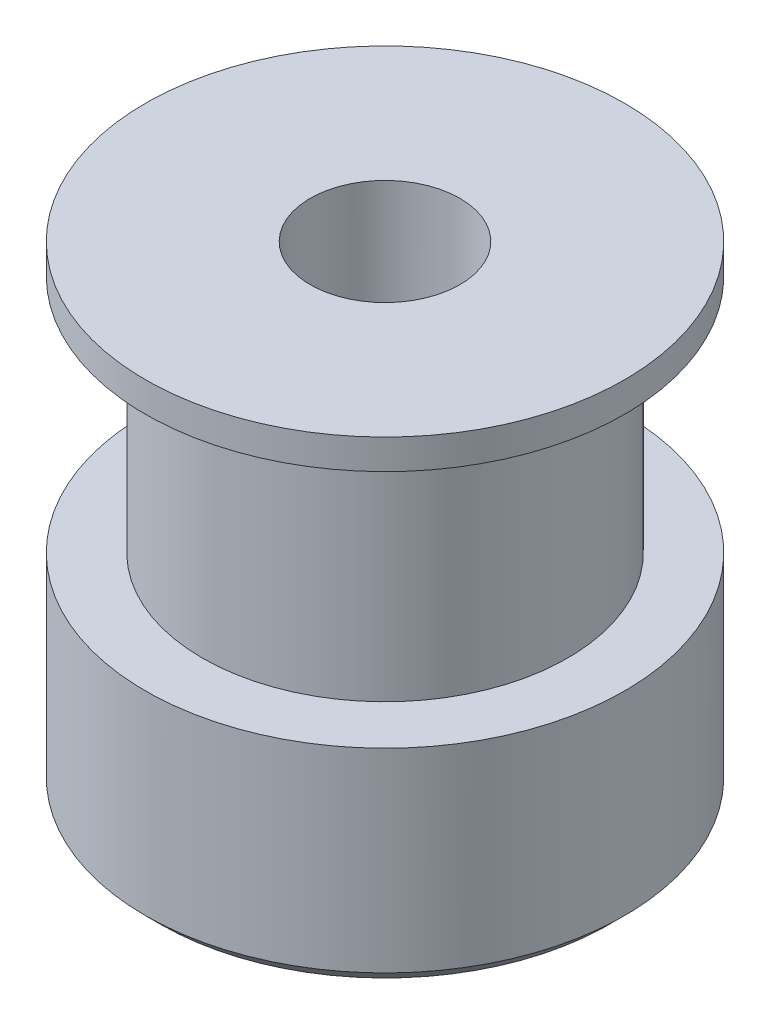
ISO-10303-21;
HEADER;
FILE_DESCRIPTION(('STEP AP214'),'2;1');
FILE_NAME('part.step','',(''),(''),'','','');
FILE_SCHEMA(('AUTOMOTIVE_DESIGN { 1 0 10303 214 1 1 1 1 }'));
ENDSEC;
DATA;
#1=APPLICATION_CONTEXT('core data for automotive mechanical design processes');
#2=APPLICATION_PROTOCOL_DEFINITION('international standard','automotive_design',2000,#1);
#3=PRODUCT_CONTEXT('',#1,'mechanical');
#4=PRODUCT('Part','Part','',(#3));
#5=PRODUCT_RELATED_PRODUCT_CATEGORY('part','',(#4));
#6=PRODUCT_DEFINITION_FORMATION('','',#4);
#7=PRODUCT_DEFINITION_CONTEXT('part definition',#1,'design');
#8=PRODUCT_DEFINITION('design','',#6,#7);
#9=PRODUCT_DEFINITION_SHAPE('','',#8);
#10=(LENGTH_UNIT() NAMED_UNIT(*) SI_UNIT(.MILLI.,.METRE.));
#11=(NAMED_UNIT(*) PLANE_ANGLE_UNIT() SI_UNIT($,.RADIAN.));
#12=(NAMED_UNIT(*) SI_UNIT($,.STERADIAN.) SOLID_ANGLE_UNIT());
#13=UNCERTAINTY_MEASURE_WITH_UNIT(LENGTH_MEASURE(1.E-05),#10,'distance_accuracy_value','');
#14=(GEOMETRIC_REPRESENTATION_CONTEXT(3) GLOBAL_UNCERTAINTY_ASSIGNED_CONTEXT((#13)) GLOBAL_UNIT_ASSIGNED_CONTEXT((#10,
#11,#12)) REPRESENTATION_CONTEXT('',''));
#15=CARTESIAN_POINT('',(0.,0.,0.));
#16=DIRECTION('',(0.,0.,1.));
#17=DIRECTION('',(1.,0.,0.));
#18=AXIS2_PLACEMENT_3D('',#15,#16,#17);
#19=CARTESIAN_POINT('',(-8.,0.,0.));
#20=DIRECTION('',(0.,1.,0.));
#21=DIRECTION('',(0.,0.,1.));
#22=AXIS2_PLACEMENT_3D('',#19,#20,#21);
#23=PLANE('',#22);
#24=CARTESIAN_POINT('',(0.,0.,0.));
#25=DIRECTION('',(0.,1.,0.));
#26=DIRECTION('',(0.,0.,1.));
#27=AXIS2_PLACEMENT_3D('',#24,#25,#26);
#28=CIRCLE('',#27,7.50000000000001);
#29=CARTESIAN_POINT('',(0.,0.,7.50000000000001));
#30=VERTEX_POINT('',#29);
#31=EDGE_CURVE('E39',#30,#30,#28,.F.);
#32=ORIENTED_EDGE('',*,*,#31,.T.);
#33=EDGE_LOOP('',(#32));
#34=FACE_BOUND('',#33,.T.);
#35=CARTESIAN_POINT('',(0.,0.,0.));
#36=DIRECTION('',(0.,-1.,0.));
#37=DIRECTION('',(0.,0.,-1.));
#38=AXIS2_PLACEMENT_3D('',#35,#36,#37);
#39=CIRCLE('',#38,2.5);
#40=CARTESIAN_POINT('',(0.,0.,-2.5));
#41=VERTEX_POINT('',#40);
#42=EDGE_CURVE('E43',#41,#41,#39,.T.);
#43=ORIENTED_EDGE('',*,*,#42,.F.);
#44=EDGE_LOOP('',(#43));
#45=FACE_BOUND('',#44,.T.);
#46=ADVANCED_FACE('F32',(#34,#45),#23,.F.);
#47=CARTESIAN_POINT('',(0.,0.,0.));
#48=DIRECTION('',(0.,-1.,0.));
#49=DIRECTION('',(0.,0.,-1.));
#50=AXIS2_PLACEMENT_3D('',#47,#48,#49);
#51=CYLINDRICAL_SURFACE('',#50,2.5);
#52=CARTESIAN_POINT('',(-2.,3.5,-1.5));
#53=CARTESIAN_POINT('',(-1.99999416642511,3.57547897528964,-1.50000404108592));
#54=CARTESIAN_POINT('',(-2.00433633903481,3.65093843407979,-1.49426852824013));
#55=CARTESIAN_POINT('',(-2.02092590613883,3.79932390396221,-1.47174965152787));
#56=CARTESIAN_POINT('',(-2.03318155043097,3.8722471873851,-1.45495475788936));
#57=CARTESIAN_POINT('',(-2.0636233903473,4.01308364167728,-1.41143486335795));
#58=CARTESIAN_POINT('',(-2.0817666618312,4.08102883803527,-1.3847815450315));
#59=CARTESIAN_POINT('',(-2.12185904995836,4.21143745336792,-1.32252909283019));
#60=CARTESIAN_POINT('',(-2.14380930122416,4.27389922969514,-1.28692729054693));
#61=CARTESIAN_POINT('',(-2.19228594587542,4.39994901666408,-1.20271292747644));
#62=CARTESIAN_POINT('',(-2.21904371037662,4.46274095712394,-1.15304179435289));
#63=CARTESIAN_POINT('',(-2.27226229431061,4.57976476274175,-1.04426801309985));
#64=CARTESIAN_POINT('',(-2.29872287517103,4.6339901516708,-0.985158296729613));
#65=CARTESIAN_POINT('',(-2.35175567858734,4.73813380970969,-0.851442367411702));
#66=CARTESIAN_POINT('',(-2.37803133577818,4.78695446366975,-0.775851995162548));
#67=CARTESIAN_POINT('',(-2.42443786983179,4.87080972244443,-0.615654228271659));
#68=CARTESIAN_POINT('',(-2.44457437988735,4.90585697412271,-0.531055196626331));
#69=CARTESIAN_POINT('',(-2.4747098780044,4.95759592281265,-0.363771406742668));
#70=CARTESIAN_POINT('',(-2.4854930393917,4.9757203609673,-0.281674698130916));
#71=CARTESIAN_POINT('',(-2.49874939277545,4.99794280286312,-0.114970509382709));
#72=CARTESIAN_POINT('',(-2.50123038813308,5.00205397800005,-0.0303654624001544));
#73=CARTESIAN_POINT('',(-2.49783372711539,4.99638625265754,0.127637283737309));
#74=CARTESIAN_POINT('',(-2.49295437513726,4.98826647383069,0.201123832865634));
#75=CARTESIAN_POINT('',(-2.47707997553857,4.96152020435189,0.345464269151767));
#76=CARTESIAN_POINT('',(-2.46608447529309,4.94289293609284,0.416317961051201));
#77=CARTESIAN_POINT('',(-2.43884907201719,4.89583443729622,0.554056780469079));
#78=CARTESIAN_POINT('',(-2.42257910450824,4.867346938861,0.620916491037617));
#79=CARTESIAN_POINT('',(-2.38609637638748,4.80161538377446,0.74898866011561));
#80=CARTESIAN_POINT('',(-2.36588259201812,4.76436905294099,0.81019964620801));
#81=CARTESIAN_POINT('',(-2.32037925976363,4.67716090719555,0.933074267143199));
#82=CARTESIAN_POINT('',(-2.2947718295215,4.62621168826426,0.993918663198193));
#83=CARTESIAN_POINT('',(-2.24255554245601,4.51559588213982,1.10671465909275));
#84=CARTESIAN_POINT('',(-2.21594536703375,4.45591749652549,1.1586540130834));
#85=CARTESIAN_POINT('',(-2.16111075123946,4.32134659383645,1.25824837767417));
#86=CARTESIAN_POINT('',(-2.13305661385124,4.24549242346054,1.30470933188632));
#87=CARTESIAN_POINT('',(-2.08250879557267,4.08529376836339,1.38397217194232));
#88=CARTESIAN_POINT('',(-2.06000490298821,4.00096528387436,1.41679921962189));
#89=CARTESIAN_POINT('',(-2.02895865196731,3.84760636810465,1.46077497064842));
#90=CARTESIAN_POINT('',(-2.01833888618316,3.77995936770336,1.47527903312665));
#91=CARTESIAN_POINT('',(-2.00392150777558,3.64262638970052,1.49480872755284));
#92=CARTESIAN_POINT('',(-2.00011596115116,3.57294287951544,1.49984538302907));
#93=CARTESIAN_POINT('',(-1.99988914321323,3.43344831756429,1.50014781114183));
#94=CARTESIAN_POINT('',(-2.00347810223984,3.36363722278479,1.49540004697659));
#95=CARTESIAN_POINT('',(-2.01751520788652,3.22601265625144,1.47640290574941));
#96=CARTESIAN_POINT('',(-2.02796877613213,3.15820080775975,1.46214601830139));
#97=CARTESIAN_POINT('',(-2.054317683331,3.02628542052021,1.42488312618657));
#98=CARTESIAN_POINT('',(-2.07020622092812,2.96217736346777,1.40188805257362));
#99=CARTESIAN_POINT('',(-2.10571539417587,2.83852228426982,1.34796261057072));
#100=CARTESIAN_POINT('',(-2.12533743689999,2.778976993634,1.31702924888212));
#101=CARTESIAN_POINT('',(-2.17036819177737,2.65475991748775,1.24167439558512));
#102=CARTESIAN_POINT('',(-2.19618239397369,2.59109916490343,1.19582663060303));
#103=CARTESIAN_POINT('',(-2.2482175480362,2.47171451515054,1.09487395518701));
#104=CARTESIAN_POINT('',(-2.27443886711455,2.41599830783088,1.03976018672402));
#105=CARTESIAN_POINT('',(-2.32835625910913,2.30677599264957,0.913274837212768));
#106=CARTESIAN_POINT('',(-2.3558007587587,2.25449927339416,0.840721108780193));
#107=CARTESIAN_POINT('',(-2.40537639133459,2.16309722316335,0.686103100868022));
#108=CARTESIAN_POINT('',(-2.42751104449411,2.12396317215908,0.604045176134704));
#109=CARTESIAN_POINT('',(-2.46252280092775,2.06313179656863,0.438840232972141));
#110=CARTESIAN_POINT('',(-2.47595588067329,2.04037377220889,0.35620596365126));
#111=CARTESIAN_POINT('',(-2.494407389061,2.00928539715374,0.187383063890859));
#112=CARTESIAN_POINT('',(-2.49943534582737,2.00093870928238,0.101198571781971));
#113=CARTESIAN_POINT('',(-2.50040600461976,1.99932539141407,-0.0598120232009817));
#114=CARTESIAN_POINT('',(-2.49747057186327,2.00419666543697,-0.134620583589704));
#115=CARTESIAN_POINT('',(-2.48512948412096,2.02489382438161,-0.282148755978772));
#116=CARTESIAN_POINT('',(-2.47572375706639,2.0407198313216,-0.354868344701912));
#117=CARTESIAN_POINT('',(-2.45149427526962,2.08221957158378,-0.495145481978795));
#118=CARTESIAN_POINT('',(-2.43675966858906,2.10773159612924,-0.562767032608828));
#119=CARTESIAN_POINT('',(-2.40303337447155,2.16764059455475,-0.692781971999982));
#120=CARTESIAN_POINT('',(-2.38404073252268,2.2020395608596,-0.75517418419983));
#121=CARTESIAN_POINT('',(-2.34093432659381,2.28292519656875,-0.880263645295945));
#122=CARTESIAN_POINT('',(-2.31648844639149,2.33031870901686,-0.942258690439938));
#123=CARTESIAN_POINT('',(-2.26601907350661,2.43375303371772,-1.05789751536306));
#124=CARTESIAN_POINT('',(-2.23999385274509,2.4898034256079,-1.11153190956916));
#125=CARTESIAN_POINT('',(-2.18528165666205,2.6172855621777,-1.2159097535057));
#126=CARTESIAN_POINT('',(-2.15667566270901,2.6897664861655,-1.26542406663367));
#127=CARTESIAN_POINT('',(-2.10376464485145,2.84348485276654,-1.35156817210325));
#128=CARTESIAN_POINT('',(-2.07945738811052,2.92471771398141,-1.38820466322661));
#129=CARTESIAN_POINT('',(-2.0408000304796,3.0870642851372,-1.44437116535132));
#130=CARTESIAN_POINT('',(-2.02577665830138,3.16759523596124,-1.46509526060187));
#131=CARTESIAN_POINT('',(-2.00539032320036,3.33209739470368,-1.49289268240426));
#132=CARTESIAN_POINT('',(-2.00000648744643,3.41606076575871,-1.49999550595837));
#133=CARTESIAN_POINT('',(-2.,3.5,-1.5));
#134=B_SPLINE_CURVE_WITH_KNOTS('',3,(#52,#53,#54,#55,#56,#57,#58,#59,#60,#61,#62,#63,#64,#65,
#66,#67,#68,#69,#70,#71,#72,#73,#74,#75,#76,#77,#78,#79,#80,#81,#82,#83,#84,#85,#86,#87,#88,#89,
#90,#91,#92,#93,#94,#95,#96,#97,#98,#99,#100,#101,#102,#103,#104,#105,#106,#107,#108,#109,#110,
#111,#112,#113,#114,#115,#116,#117,#118,#119,#120,#121,#122,#123,#124,#125,#126,#127,#128,#129,
#130,#131,#132,#133),.UNSPECIFIED.,.T.,.F.,(4,2,2,2,2,2,2,2,2,2,2,2,2,2,2,2,2,2,2,2,2,2,2,2,2,2,
2,2,2,2,2,2,2,2,2,2,2,2,2,2,4),(0.,0.226085249493393,0.45240657433077,0.677113624991876,
0.901887762215933,1.15414462390001,1.40659128601844,1.68630157736223,1.9657544327122,
2.21853330858497,2.47107452602766,2.69230130543181,2.91354445887944,3.13607155036377,
3.35865648368878,3.60782810055849,3.85733966656908,4.13576671140276,4.41367760154768,
4.62276298054684,4.83160475643976,5.04073566011181,5.25003193304128,5.45906724365495,
5.6681814915466,5.91499438482002,6.16204457978454,6.44121828011588,6.72020638384847,
6.97891479383337,7.23732973022726,7.46129321849399,7.68525920139648,7.90563970188756,
8.12606965394584,8.37042963549487,8.61506198741954,8.89071695766603,9.16622832484805,
9.41820120134353,9.66962780912277),.UNSPECIFIED.);
#135=CARTESIAN_POINT('',(-2.,3.5,-1.5));
#136=VERTEX_POINT('',#135);
#137=EDGE_CURVE('E97',#136,#136,#134,.T.);
#138=ORIENTED_EDGE('',*,*,#137,.F.);
#139=EDGE_LOOP('',(#138));
#140=FACE_BOUND('',#139,.T.);
#141=CARTESIAN_POINT('',(1.5,3.5,-2.));
#142=CARTESIAN_POINT('',(1.50000404108592,3.57547897528964,-1.99999416642511));
#143=CARTESIAN_POINT('',(1.49426852824014,3.6509384340798,-2.00433633903481));
#144=CARTESIAN_POINT('',(1.47174965152787,3.79932390396222,-2.02092590613883));
#145=CARTESIAN_POINT('',(1.45495475788936,3.8722471873851,-2.03318155043097));
#146=CARTESIAN_POINT('',(1.41143486335795,4.01308364167728,-2.0636233903473));
#147=CARTESIAN_POINT('',(1.3847815450315,4.08102883803527,-2.08176666183119));
#148=CARTESIAN_POINT('',(1.32252909283019,4.21143745336792,-2.12185904995836));
#149=CARTESIAN_POINT('',(1.28692729054693,4.27389922969514,-2.14380930122416));
#150=CARTESIAN_POINT('',(1.20271292747644,4.39994901666408,-2.19228594587542));
#151=CARTESIAN_POINT('',(1.15304179435289,4.46274095712394,-2.21904371037662));
#152=CARTESIAN_POINT('',(1.04426801309985,4.57976476274175,-2.27226229431061));
#153=CARTESIAN_POINT('',(0.985158296729613,4.6339901516708,-2.29872287517103));
#154=CARTESIAN_POINT('',(0.851442367411702,4.7381338097097,-2.35175567858734));
#155=CARTESIAN_POINT('',(0.775851995162548,4.78695446366975,-2.37803133577818));
#156=CARTESIAN_POINT('',(0.615654228271659,4.87080972244443,-2.42443786983179));
#157=CARTESIAN_POINT('',(0.531055196626331,4.90585697412271,-2.44457437988735));
#158=CARTESIAN_POINT('',(0.363771406742667,4.95759592281265,-2.4747098780044));
#159=CARTESIAN_POINT('',(0.281674698130916,4.9757203609673,-2.4854930393917));
#160=CARTESIAN_POINT('',(0.114970509382708,4.99794280286312,-2.49874939277545));
#161=CARTESIAN_POINT('',(0.0303654624001538,5.00205397800006,-2.50123038813308));
#162=CARTESIAN_POINT('',(-0.127637283737309,4.99638625265754,-2.49783372711539));
#163=CARTESIAN_POINT('',(-0.201123832865634,4.98826647383069,-2.49295437513726));
#164=CARTESIAN_POINT('',(-0.345464269151768,4.96152020435189,-2.47707997553857));
#165=CARTESIAN_POINT('',(-0.416317961051201,4.94289293609285,-2.46608447529309));
#166=CARTESIAN_POINT('',(-0.554056780469079,4.89583443729622,-2.43884907201719));
#167=CARTESIAN_POINT('',(-0.620916491037617,4.867346938861,-2.42257910450824));
#168=CARTESIAN_POINT('',(-0.748988660115611,4.80161538377446,-2.38609637638748));
#169=CARTESIAN_POINT('',(-0.810199646208011,4.76436905294099,-2.36588259201812));
#170=CARTESIAN_POINT('',(-0.933074267143199,4.67716090719555,-2.32037925976363));
#171=CARTESIAN_POINT('',(-0.993918663198193,4.62621168826426,-2.2947718295215));
#172=CARTESIAN_POINT('',(-1.10671465909275,4.51559588213982,-2.24255554245601));
#173=CARTESIAN_POINT('',(-1.1586540130834,4.45591749652549,-2.21594536703375));
#174=CARTESIAN_POINT('',(-1.25824837767417,4.32134659383645,-2.16111075123946));
#175=CARTESIAN_POINT('',(-1.30470933188632,4.24549242346054,-2.13305661385124));
#176=CARTESIAN_POINT('',(-1.38397217194232,4.08529376836339,-2.08250879557267));
#177=CARTESIAN_POINT('',(-1.41679921962189,4.00096528387436,-2.06000490298821));
#178=CARTESIAN_POINT('',(-1.46077497064842,3.84760636810465,-2.02895865196731));
#179=CARTESIAN_POINT('',(-1.47527903312665,3.77995936770336,-2.01833888618316));
#180=CARTESIAN_POINT('',(-1.49480872755284,3.64262638970052,-2.00392150777558));
#181=CARTESIAN_POINT('',(-1.49984538302907,3.57294287951544,-2.00011596115116));
#182=CARTESIAN_POINT('',(-1.50014781114183,3.43344831756429,-1.99988914321323));
#183=CARTESIAN_POINT('',(-1.49540004697659,3.36363722278479,-2.00347810223984));
#184=CARTESIAN_POINT('',(-1.47640290574941,3.22601265625144,-2.01751520788652));
#185=CARTESIAN_POINT('',(-1.46214601830139,3.15820080775975,-2.02796877613213));
#186=CARTESIAN_POINT('',(-1.42488312618657,3.02628542052021,-2.054317683331));
#187=CARTESIAN_POINT('',(-1.40188805257362,2.96217736346777,-2.07020622092812));
#188=CARTESIAN_POINT('',(-1.34796261057072,2.83852228426982,-2.10571539417587));
#189=CARTESIAN_POINT('',(-1.31702924888212,2.778976993634,-2.12533743689999));
#190=CARTESIAN_POINT('',(-1.24167439558512,2.65475991748775,-2.17036819177737));
#191=CARTESIAN_POINT('',(-1.19582663060303,2.59109916490343,-2.19618239397369));
#192=CARTESIAN_POINT('',(-1.09487395518701,2.47171451515054,-2.24821754803621));
#193=CARTESIAN_POINT('',(-1.03976018672402,2.41599830783088,-2.27443886711455));
#194=CARTESIAN_POINT('',(-0.913274837212766,2.30677599264957,-2.32835625910913));
#195=CARTESIAN_POINT('',(-0.84072110878019,2.25449927339416,-2.3558007587587));
#196=CARTESIAN_POINT('',(-0.686103100868019,2.16309722316335,-2.40537639133459));
#197=CARTESIAN_POINT('',(-0.604045176134701,2.12396317215908,-2.42751104449411));
#198=CARTESIAN_POINT('',(-0.438840232972137,2.06313179656863,-2.46252280092775));
#199=CARTESIAN_POINT('',(-0.356205963651257,2.04037377220889,-2.47595588067329));
#200=CARTESIAN_POINT('',(-0.187383063890856,2.00928539715374,-2.494407389061));
#201=CARTESIAN_POINT('',(-0.101198571781968,2.00093870928238,-2.49943534582737));
#202=CARTESIAN_POINT('',(0.0598120232009852,1.99932539141407,-2.50040600461976));
#203=CARTESIAN_POINT('',(0.134620583589707,2.00419666543697,-2.49747057186327));
#204=CARTESIAN_POINT('',(0.282148755978775,2.02489382438162,-2.48512948412096));
#205=CARTESIAN_POINT('',(0.354868344701915,2.0407198313216,-2.47572375706639));
#206=CARTESIAN_POINT('',(0.495145481978798,2.08221957158379,-2.45149427526962));
#207=CARTESIAN_POINT('',(0.562767032608831,2.10773159612925,-2.43675966858906));
#208=CARTESIAN_POINT('',(0.692781971999985,2.16764059455475,-2.40303337447155));
#209=CARTESIAN_POINT('',(0.755174184199833,2.2020395608596,-2.38404073252268));
#210=CARTESIAN_POINT('',(0.880263645295948,2.28292519656876,-2.34093432659381));
#211=CARTESIAN_POINT('',(0.942258690439941,2.33031870901687,-2.31648844639149));
#212=CARTESIAN_POINT('',(1.05789751536307,2.43375303371772,-2.26601907350661));
#213=CARTESIAN_POINT('',(1.11153190956916,2.48980342560791,-2.23999385274509));
#214=CARTESIAN_POINT('',(1.2159097535057,2.6172855621777,-2.18528165666204));
#215=CARTESIAN_POINT('',(1.26542406663368,2.6897664861655,-2.15667566270901));
#216=CARTESIAN_POINT('',(1.35156817210325,2.84348485276654,-2.10376464485145));
#217=CARTESIAN_POINT('',(1.38820466322661,2.92471771398142,-2.07945738811052));
#218=CARTESIAN_POINT('',(1.44437116535132,3.0870642851372,-2.0408000304796));
#219=CARTESIAN_POINT('',(1.46509526060187,3.16759523596125,-2.02577665830138));
#220=CARTESIAN_POINT('',(1.49289268240426,3.33209739470368,-2.00539032320036));
#221=CARTESIAN_POINT('',(1.49999550595837,3.41606076575871,-2.00000648744643));
#222=CARTESIAN_POINT('',(1.5,3.5,-2.));
#223=B_SPLINE_CURVE_WITH_KNOTS('',3,(#141,#142,#143,#144,#145,#146,#147,#148,#149,#150,#151,
#152,#153,#154,#155,#156,#157,#158,#159,#160,#161,#162,#163,#164,#165,#166,#167,#168,#169,#170,
#171,#172,#173,#174,#175,#176,#177,#178,#179,#180,#181,#182,#183,#184,#185,#186,#187,#188,#189,
#190,#191,#192,#193,#194,#195,#196,#197,#198,#199,#200,#201,#202,#203,#204,#205,#206,#207,#208,
#209,#210,#211,#212,#213,#214,#215,#216,#217,#218,#219,#220,#221,#222),.UNSPECIFIED.,.T.,.F.,(4,
2,2,2,2,2,2,2,2,2,2,2,2,2,2,2,2,2,2,2,2,2,2,2,2,2,2,2,2,2,2,2,2,2,2,2,2,2,2,2,4),(0.,
0.226085249493392,0.45240657433077,0.677113624991875,0.901887762215933,1.15414462390001,
1.40659128601844,1.68630157736223,1.9657544327122,2.21853330858497,2.47107452602766,
2.69230130543182,2.91354445887944,3.13607155036377,3.35865648368878,3.60782810055849,
3.85733966656908,4.13576671140276,4.41367760154768,4.62276298054684,4.83160475643976,
5.04073566011181,5.25003193304128,5.45906724365495,5.66818149154661,5.91499438482002,
6.16204457978454,6.44121828011588,6.72020638384847,6.97891479383337,7.23732973022726,
7.46129321849399,7.68525920139648,7.90563970188756,8.12606965394584,8.37042963549487,
8.61506198741955,8.89071695766604,9.16622832484805,9.41820120134354,9.66962780912277),.UNSPECIFIED.);
#224=CARTESIAN_POINT('',(1.5,3.5,-2.));
#225=VERTEX_POINT('',#224);
#226=EDGE_CURVE('E67',#225,#225,#223,.T.);
#227=ORIENTED_EDGE('',*,*,#226,.F.);
#228=EDGE_LOOP('',(#227));
#229=FACE_BOUND('',#228,.T.);
#230=CARTESIAN_POINT('',(0.,16.,0.));
#231=DIRECTION('',(0.,-1.,0.));
#232=DIRECTION('',(0.,0.,-1.));
#233=AXIS2_PLACEMENT_3D('',#230,#231,#232);
#234=CIRCLE('',#233,2.5);
#235=CARTESIAN_POINT('',(0.,16.,-2.5));
#236=VERTEX_POINT('',#235);
#237=EDGE_CURVE('E47',#236,#236,#234,.T.);
#238=ORIENTED_EDGE('',*,*,#237,.F.);
#239=EDGE_LOOP('',(#238));
#240=FACE_BOUND('',#239,.T.);
#241=ORIENTED_EDGE('',*,*,#42,.T.);
#242=EDGE_LOOP('',(#241));
#243=FACE_BOUND('',#242,.T.);
#244=ADVANCED_FACE('F141',(#140,#229,#240,#243),#51,.F.);
#245=CARTESIAN_POINT('',(-2.5,16.,0.));
#246=DIRECTION('',(0.,-1.,0.));
#247=DIRECTION('',(0.,0.,-1.));
#248=AXIS2_PLACEMENT_3D('',#245,#246,#247);
#249=PLANE('',#248);
#250=CARTESIAN_POINT('',(0.,16.,0.));
#251=DIRECTION('',(0.,-1.,0.));
#252=DIRECTION('',(0.,0.,-1.));
#253=AXIS2_PLACEMENT_3D('',#250,#251,#252);
#254=CIRCLE('',#253,8.);
#255=CARTESIAN_POINT('',(0.,16.,-8.));
#256=VERTEX_POINT('',#255);
#257=EDGE_CURVE('E52',#256,#256,#254,.T.);
#258=ORIENTED_EDGE('',*,*,#257,.F.);
#259=EDGE_LOOP('',(#258));
#260=FACE_BOUND('',#259,.T.);
#261=ORIENTED_EDGE('',*,*,#237,.T.);
#262=EDGE_LOOP('',(#261));
#263=FACE_BOUND('',#262,.T.);
#264=ADVANCED_FACE('F135',(#260,#263),#249,.F.);
#265=CARTESIAN_POINT('',(0.,0.,0.));
#266=DIRECTION('',(0.,-1.,0.));
#267=DIRECTION('',(0.,0.,-1.));
#268=AXIS2_PLACEMENT_3D('',#265,#266,#267);
#269=CYLINDRICAL_SURFACE('',#268,8.);
#270=CARTESIAN_POINT('',(0.,15.,0.));
#271=DIRECTION('',(0.,-1.,0.));
#272=DIRECTION('',(0.,0.,-1.));
#273=AXIS2_PLACEMENT_3D('',#270,#271,#272);
#274=CIRCLE('',#273,8.);
#275=CARTESIAN_POINT('',(0.,15.,-8.));
#276=VERTEX_POINT('',#275);
#277=EDGE_CURVE('E55',#276,#276,#274,.T.);
#278=ORIENTED_EDGE('',*,*,#277,.F.);
#279=EDGE_LOOP('',(#278));
#280=FACE_BOUND('',#279,.T.);
#281=ORIENTED_EDGE('',*,*,#257,.T.);
#282=EDGE_LOOP('',(#281));
#283=FACE_BOUND('',#282,.T.);
#284=ADVANCED_FACE('F129',(#280,#283),#269,.T.);
#285=CARTESIAN_POINT('',(-8.,15.,0.));
#286=DIRECTION('',(0.,1.,0.));
#287=DIRECTION('',(0.,0.,1.));
#288=AXIS2_PLACEMENT_3D('',#285,#286,#287);
#289=PLANE('',#288);
#290=CARTESIAN_POINT('',(0.,15.,0.));
#291=DIRECTION('',(0.,-1.,0.));
#292=DIRECTION('',(0.,0.,-1.));
#293=AXIS2_PLACEMENT_3D('',#290,#291,#292);
#294=CIRCLE('',#293,6.1);
#295=CARTESIAN_POINT('',(0.,15.,-6.1));
#296=VERTEX_POINT('',#295);
#297=EDGE_CURVE('E58',#296,#296,#294,.T.);
#298=ORIENTED_EDGE('',*,*,#297,.F.);
#299=EDGE_LOOP('',(#298));
#300=FACE_BOUND('',#299,.T.);
#301=ORIENTED_EDGE('',*,*,#277,.T.);
#302=EDGE_LOOP('',(#301));
#303=FACE_BOUND('',#302,.T.);
#304=ADVANCED_FACE('F123',(#300,#303),#289,.F.);
#305=CARTESIAN_POINT('',(0.,0.,0.));
#306=DIRECTION('',(0.,-1.,0.));
#307=DIRECTION('',(0.,0.,-1.));
#308=AXIS2_PLACEMENT_3D('',#305,#306,#307);
#309=CYLINDRICAL_SURFACE('',#308,6.1);
#310=CARTESIAN_POINT('',(0.,7.,0.));
#311=DIRECTION('',(0.,-1.,0.));
#312=DIRECTION('',(0.,0.,-1.));
#313=AXIS2_PLACEMENT_3D('',#310,#311,#312);
#314=CIRCLE('',#313,6.1);
#315=CARTESIAN_POINT('',(0.,7.,-6.1));
#316=VERTEX_POINT('',#315);
#317=EDGE_CURVE('E61',#316,#316,#314,.T.);
#318=ORIENTED_EDGE('',*,*,#317,.F.);
#319=EDGE_LOOP('',(#318));
#320=FACE_BOUND('',#319,.T.);
#321=ORIENTED_EDGE('',*,*,#297,.T.);
#322=EDGE_LOOP('',(#321));
#323=FACE_BOUND('',#322,.T.);
#324=ADVANCED_FACE('F117',(#320,#323),#309,.T.);
#325=CARTESIAN_POINT('',(-6.1,7.,0.));
#326=DIRECTION('',(0.,-1.,0.));
#327=DIRECTION('',(0.,0.,-1.));
#328=AXIS2_PLACEMENT_3D('',#325,#326,#327);
#329=PLANE('',#328);
#330=CARTESIAN_POINT('',(0.,7.,0.));
#331=DIRECTION('',(0.,-1.,0.));
#332=DIRECTION('',(0.,0.,-1.));
#333=AXIS2_PLACEMENT_3D('',#330,#331,#332);
#334=CIRCLE('',#333,8.);
#335=CARTESIAN_POINT('',(0.,7.,-8.));
#336=VERTEX_POINT('',#335);
#337=EDGE_CURVE('E64',#336,#336,#334,.T.);
#338=ORIENTED_EDGE('',*,*,#337,.F.);
#339=EDGE_LOOP('',(#338));
#340=FACE_BOUND('',#339,.T.);
#341=ORIENTED_EDGE('',*,*,#317,.T.);
#342=EDGE_LOOP('',(#341));
#343=FACE_BOUND('',#342,.T.);
#344=ADVANCED_FACE('F110',(#340,#343),#329,.F.);
#345=CARTESIAN_POINT('',(0.,0.,0.));
#346=DIRECTION('',(0.,-1.,0.));
#347=DIRECTION('',(0.,0.,-1.));
#348=AXIS2_PLACEMENT_3D('',#345,#346,#347);
#349=CYLINDRICAL_SURFACE('',#348,8.);
#350=CARTESIAN_POINT('',(-7.85811682275086,3.5,-1.5));
#351=CARTESIAN_POINT('',(-7.85811843793494,3.41654279198826,-1.49999679883246));
#352=CARTESIAN_POINT('',(-7.85946079760266,3.33304405178161,-1.49301126348936));
#353=CARTESIAN_POINT('',(-7.86467851014364,3.16840103841809,-1.46527253251805));
#354=CARTESIAN_POINT('',(-7.86855601173205,3.08725882357252,-1.44450765768477));
#355=CARTESIAN_POINT('',(-7.87838976464885,2.92973492862912,-1.38987035617788));
#356=CARTESIAN_POINT('',(-7.88434407905997,2.85334889069271,-1.35601013954374));
#357=CARTESIAN_POINT('',(-7.89765826320959,2.70734644071319,-1.27617565760366));
#358=CARTESIAN_POINT('',(-7.90501802325622,2.6377295009967,-1.23020233759193));
#359=CARTESIAN_POINT('',(-7.92041614838944,2.50636980080087,-1.12683678942622));
#360=CARTESIAN_POINT('',(-7.92846116625679,2.44472351652827,-1.06932292933092));
#361=CARTESIAN_POINT('',(-7.94426457664034,2.33189561040043,-0.944771778803551));
#362=CARTESIAN_POINT('',(-7.95202295031153,2.2807146755752,-0.877733863624944));
#363=CARTESIAN_POINT('',(-7.96645017828405,2.18990062339948,-0.735403894570162));
#364=CARTESIAN_POINT('',(-7.97311028052363,2.15035846648058,-0.660052840033865));
#365=CARTESIAN_POINT('',(-7.98451608632931,2.08453045772647,-0.503631283250762));
#366=CARTESIAN_POINT('',(-7.98926194728334,2.05824351600978,-0.422561251859506));
#367=CARTESIAN_POINT('',(-7.99625755123778,2.01997045138887,-0.258002746187416));
#368=CARTESIAN_POINT('',(-7.99853565976327,2.00782169407731,-0.174553323244857));
#369=CARTESIAN_POINT('',(-8.00043684615594,1.9976631122996,-0.00677167603538291));
#370=CARTESIAN_POINT('',(-8.00006015010697,1.99965208386094,0.0775604724476704));
#371=CARTESIAN_POINT('',(-7.99671633763241,2.01758777114715,0.243598357899397));
#372=CARTESIAN_POINT('',(-7.99378172247214,2.03335936943001,0.32532376045147));
#373=CARTESIAN_POINT('',(-7.98568826333561,2.07813564939524,0.484947165715476));
#374=CARTESIAN_POINT('',(-7.98052933829966,2.1071408133458,0.562845028826541));
#375=CARTESIAN_POINT('',(-7.96851260297339,2.1777277310583,0.713110065751521));
#376=CARTESIAN_POINT('',(-7.96164537590825,2.2193794879125,0.785443571838533));
#377=CARTESIAN_POINT('',(-7.9469714754285,2.31402566907715,0.922159977214638));
#378=CARTESIAN_POINT('',(-7.93916470651164,2.36702124688758,0.986542066910785));
#379=CARTESIAN_POINT('',(-7.92333513680567,2.48381570298353,1.10656561896904));
#380=CARTESIAN_POINT('',(-7.91531085901621,2.54776778390207,1.16205790757041));
#381=CARTESIAN_POINT('',(-7.9000650892462,2.68414953127862,1.26155171851261));
#382=CARTESIAN_POINT('',(-7.89284360901351,2.75657932176463,1.30555307271182));
#383=CARTESIAN_POINT('',(-7.88001893307121,2.90805827070266,1.38085852224478));
#384=CARTESIAN_POINT('',(-7.87441850530261,2.98711845719064,1.41214093645421));
#385=CARTESIAN_POINT('',(-7.86551242396689,3.1495011841232,1.46093656975056));
#386=CARTESIAN_POINT('',(-7.8622065103862,3.23282324046478,1.47845134901108));
#387=CARTESIAN_POINT('',(-7.85831520301005,3.40001932885588,1.49899672649739));
#388=CARTESIAN_POINT('',(-7.85768955816136,3.48386611556551,1.50224164285859));
#389=CARTESIAN_POINT('',(-7.8591219142084,3.65090345508715,1.49472968881724));
#390=CARTESIAN_POINT('',(-7.86117978238611,3.73409404014808,1.48397351086433));
#391=CARTESIAN_POINT('',(-7.86770980063205,3.89675290305439,1.44894868195883));
#392=CARTESIAN_POINT('',(-7.87216186690878,3.97624625262489,1.4247923858399));
#393=CARTESIAN_POINT('',(-7.88296134156618,4.13005718973016,1.3637722437906));
#394=CARTESIAN_POINT('',(-7.88930888963281,4.20437439531533,1.32690746128795));
#395=CARTESIAN_POINT('',(-7.90327577863685,4.34666761904317,1.2410235311966));
#396=CARTESIAN_POINT('',(-7.91090895425315,4.41456053786607,1.19186899639621));
#397=CARTESIAN_POINT('',(-7.926548113681,4.54121204021433,1.08298344344247));
#398=CARTESIAN_POINT('',(-7.93455413096494,4.59996980155577,1.02325147433084));
#399=CARTESIAN_POINT('',(-7.95016624005946,4.70748376353412,0.893949417870385));
#400=CARTESIAN_POINT('',(-7.95776555833305,4.75609582660596,0.82425853409589));
#401=CARTESIAN_POINT('',(-7.97159404810351,4.84092120617766,0.67757452304014));
#402=CARTESIAN_POINT('',(-7.97782327234725,4.877135000025,0.600581677038528));
#403=CARTESIAN_POINT('',(-7.98818057995848,4.93592009786408,0.441877541578684));
#404=CARTESIAN_POINT('',(-7.99231954730142,4.95856218756141,0.360193213078988));
#405=CARTESIAN_POINT('',(-7.99807642083745,4.98978704828988,0.194096227381571));
#406=CARTESIAN_POINT('',(-7.99969459229933,4.99837129866271,0.109683858215851));
#407=CARTESIAN_POINT('',(-8.00022227515441,5.00118530151844,-0.058090760250509));
#408=CARTESIAN_POINT('',(-7.99917286625032,4.99563275312953,-0.141449307066268));
#409=CARTESIAN_POINT('',(-7.99456866611703,4.97080757223156,-0.306023369279199));
#410=CARTESIAN_POINT('',(-7.99101389890671,4.95153507125579,-0.387238905213689));
#411=CARTESIAN_POINT('',(-7.98179837978045,4.89990879261628,-0.545106475595485));
#412=CARTESIAN_POINT('',(-7.97614135981576,4.86757818711899,-0.621766319318223));
#413=CARTESIAN_POINT('',(-7.96333372068771,4.79077954634482,-0.768605631316694));
#414=CARTESIAN_POINT('',(-7.95618300146483,4.74631069789335,-0.838784665003271));
#415=CARTESIAN_POINT('',(-7.94104779859941,4.64574854555768,-0.971755027780007));
#416=CARTESIAN_POINT('',(-7.93305284591272,4.58949796613829,-1.03442623539053));
#417=CARTESIAN_POINT('',(-7.91719633538833,4.46729543750729,-1.14951536065485));
#418=CARTESIAN_POINT('',(-7.90933480936765,4.40134120962628,-1.2019308632478));
#419=CARTESIAN_POINT('',(-7.89455577425926,4.26087354529665,-1.29547633945385));
#420=CARTESIAN_POINT('',(-7.88764767280729,4.18628656033236,-1.33649740531872));
#421=CARTESIAN_POINT('',(-7.87567084650033,4.03117421002026,-1.40536132423417));
#422=CARTESIAN_POINT('',(-7.87060038649116,3.95065453341062,-1.43321661638912));
#423=CARTESIAN_POINT('',(-7.86393016292125,3.80824771193408,-1.46929726596175));
#424=CARTESIAN_POINT('',(-7.86176310717932,3.74719427623805,-1.4807910573985));
#425=CARTESIAN_POINT('',(-7.85885585595504,3.62410153157968,-1.49614351076215));
#426=CARTESIAN_POINT('',(-7.85811562163282,3.56206224949967,-1.50000238052127));
#427=CARTESIAN_POINT('',(-7.85811682275086,3.5,-1.5));
#428=B_SPLINE_CURVE_WITH_KNOTS('',3,(#350,#351,#352,#353,#354,#355,#356,#357,#358,#359,#360,
#361,#362,#363,#364,#365,#366,#367,#368,#369,#370,#371,#372,#373,#374,#375,#376,#377,#378,#379,
#380,#381,#382,#383,#384,#385,#386,#387,#388,#389,#390,#391,#392,#393,#394,#395,#396,#397,#398,
#399,#400,#401,#402,#403,#404,#405,#406,#407,#408,#409,#410,#411,#412,#413,#414,#415,#416,#417,
#418,#419,#420,#421,#422,#423,#424,#425,#426,#427),.UNSPECIFIED.,.T.,.F.,(4,2,2,2,2,2,2,2,2,2,2,
2,2,2,2,2,2,2,2,2,2,2,2,2,2,2,2,2,2,2,2,2,2,2,2,2,2,2,4),(0.,0.250144505793187,
0.500501302380393,0.750625227978432,1.00072963993908,1.25362335698691,1.50653367069315,
1.76137104348047,2.0161874593964,2.26804275460261,2.51987660200648,2.76855650598725,
3.01724547328425,3.26733691984219,3.51745380911785,3.77140614764064,4.025362201924,
4.27974936118266,4.53410768866488,4.78463248587075,5.03514489338718,5.28358792315368,
5.53204926624317,5.78337862654143,6.03473059394677,6.28944125495871,6.54414210821705,
6.79750269418683,7.0508366166733,7.30029300570138,7.54974700322167,7.79876026530358,
8.0477902135711,8.30038464008745,8.55303847730765,8.80803001818118,9.06278015749119,
9.24880307527215,9.43482092920425),.UNSPECIFIED.);
#429=CARTESIAN_POINT('',(-7.85811682275086,3.5,-1.5));
#430=VERTEX_POINT('',#429);
#431=EDGE_CURVE('E94',#430,#430,#428,.T.);
#432=ORIENTED_EDGE('',*,*,#431,.F.);
#433=EDGE_LOOP('',(#432));
#434=FACE_BOUND('',#433,.T.);
#435=CARTESIAN_POINT('',(1.5,3.5,-7.85811682275086));
#436=CARTESIAN_POINT('',(1.49999679883246,3.41654279198826,-7.85811843793493));
#437=CARTESIAN_POINT('',(1.49301126348936,3.33304405178161,-7.85946079760266));
#438=CARTESIAN_POINT('',(1.46527253251805,3.16840103841809,-7.86467851014364));
#439=CARTESIAN_POINT('',(1.44450765768477,3.08725882357252,-7.86855601173205));
#440=CARTESIAN_POINT('',(1.38987035617788,2.92973492862913,-7.87838976464885));
#441=CARTESIAN_POINT('',(1.35601013954374,2.85334889069271,-7.88434407905997));
#442=CARTESIAN_POINT('',(1.27617565760366,2.70734644071319,-7.89765826320959));
#443=CARTESIAN_POINT('',(1.23020233759193,2.6377295009967,-7.90501802325622));
#444=CARTESIAN_POINT('',(1.12683678942622,2.50636980080087,-7.92041614838944));
#445=CARTESIAN_POINT('',(1.06932292933092,2.44472351652827,-7.92846116625679));
#446=CARTESIAN_POINT('',(0.944771778803551,2.33189561040044,-7.94426457664034));
#447=CARTESIAN_POINT('',(0.877733863624945,2.28071467557521,-7.95202295031153));
#448=CARTESIAN_POINT('',(0.735403894570163,2.18990062339948,-7.96645017828405));
#449=CARTESIAN_POINT('',(0.660052840033866,2.15035846648058,-7.97311028052363));
#450=CARTESIAN_POINT('',(0.503631283250762,2.08453045772647,-7.98451608632931));
#451=CARTESIAN_POINT('',(0.422561251859506,2.05824351600978,-7.98926194728334));
#452=CARTESIAN_POINT('',(0.258002746187416,2.01997045138887,-7.99625755123778));
#453=CARTESIAN_POINT('',(0.174553323244857,2.00782169407732,-7.99853565976327));
#454=CARTESIAN_POINT('',(0.00677167603538354,1.9976631122996,-8.00043684615594));
#455=CARTESIAN_POINT('',(-0.0775604724476698,1.99965208386094,-8.00006015010697));
#456=CARTESIAN_POINT('',(-0.243598357899396,2.01758777114715,-7.99671633763241));
#457=CARTESIAN_POINT('',(-0.325323760451469,2.03335936943001,-7.99378172247214));
#458=CARTESIAN_POINT('',(-0.484947165715475,2.07813564939524,-7.98568826333561));
#459=CARTESIAN_POINT('',(-0.56284502882654,2.1071408133458,-7.98052933829966));
#460=CARTESIAN_POINT('',(-0.713110065751521,2.1777277310583,-7.96851260297339));
#461=CARTESIAN_POINT('',(-0.785443571838532,2.2193794879125,-7.96164537590825));
#462=CARTESIAN_POINT('',(-0.922159977214637,2.31402566907715,-7.9469714754285));
#463=CARTESIAN_POINT('',(-0.986542066910784,2.36702124688758,-7.93916470651164));
#464=CARTESIAN_POINT('',(-1.10656561896904,2.48381570298353,-7.92333513680567));
#465=CARTESIAN_POINT('',(-1.16205790757041,2.54776778390207,-7.91531085901621));
#466=CARTESIAN_POINT('',(-1.2615517185126,2.68414953127862,-7.90006508924621));
#467=CARTESIAN_POINT('',(-1.30555307271182,2.75657932176463,-7.89284360901351));
#468=CARTESIAN_POINT('',(-1.38085852224478,2.90805827070266,-7.88001893307122));
#469=CARTESIAN_POINT('',(-1.41214093645421,2.98711845719064,-7.87441850530261));
#470=CARTESIAN_POINT('',(-1.46093656975056,3.1495011841232,-7.86551242396689));
#471=CARTESIAN_POINT('',(-1.47845134901108,3.23282324046478,-7.8622065103862));
#472=CARTESIAN_POINT('',(-1.49899672649739,3.40001932885588,-7.85831520301005));
#473=CARTESIAN_POINT('',(-1.50224164285859,3.48386611556551,-7.85768955816137));
#474=CARTESIAN_POINT('',(-1.49472968881724,3.65090345508715,-7.8591219142084));
#475=CARTESIAN_POINT('',(-1.48397351086433,3.73409404014808,-7.86117978238611));
#476=CARTESIAN_POINT('',(-1.44894868195883,3.89675290305439,-7.86770980063205));
#477=CARTESIAN_POINT('',(-1.4247923858399,3.9762462526249,-7.87216186690878));
#478=CARTESIAN_POINT('',(-1.3637722437906,4.13005718973016,-7.88296134156619));
#479=CARTESIAN_POINT('',(-1.32690746128795,4.20437439531533,-7.88930888963281));
#480=CARTESIAN_POINT('',(-1.2410235311966,4.34666761904317,-7.90327577863685));
#481=CARTESIAN_POINT('',(-1.19186899639621,4.41456053786607,-7.91090895425315));
#482=CARTESIAN_POINT('',(-1.08298344344247,4.54121204021433,-7.926548113681));
#483=CARTESIAN_POINT('',(-1.02325147433084,4.59996980155577,-7.93455413096494));
#484=CARTESIAN_POINT('',(-0.893949417870385,4.70748376353413,-7.95016624005946));
#485=CARTESIAN_POINT('',(-0.824258534095891,4.75609582660597,-7.95776555833305));
#486=CARTESIAN_POINT('',(-0.67757452304014,4.84092120617766,-7.97159404810351));
#487=CARTESIAN_POINT('',(-0.600581677038528,4.87713500002501,-7.97782327234725));
#488=CARTESIAN_POINT('',(-0.441877541578684,4.93592009786408,-7.98818057995848));
#489=CARTESIAN_POINT('',(-0.360193213078988,4.95856218756141,-7.99231954730142));
#490=CARTESIAN_POINT('',(-0.194096227381571,4.98978704828989,-7.99807642083745));
#491=CARTESIAN_POINT('',(-0.109683858215851,4.99837129866271,-7.99969459229933));
#492=CARTESIAN_POINT('',(0.0580907602505086,5.00118530151844,-8.00022227515441));
#493=CARTESIAN_POINT('',(0.141449307066267,4.99563275312953,-7.99917286625032));
#494=CARTESIAN_POINT('',(0.306023369279199,4.97080757223157,-7.99456866611703));
#495=CARTESIAN_POINT('',(0.387238905213689,4.95153507125579,-7.99101389890671));
#496=CARTESIAN_POINT('',(0.545106475595484,4.89990879261628,-7.98179837978045));
#497=CARTESIAN_POINT('',(0.621766319318223,4.86757818711899,-7.97614135981576));
#498=CARTESIAN_POINT('',(0.768605631316694,4.79077954634482,-7.96333372068771));
#499=CARTESIAN_POINT('',(0.83878466500327,4.74631069789335,-7.95618300146483));
#500=CARTESIAN_POINT('',(0.971755027780006,4.64574854555768,-7.94104779859941));
#501=CARTESIAN_POINT('',(1.03442623539053,4.5894979661383,-7.93305284591272));
#502=CARTESIAN_POINT('',(1.14951536065485,4.46729543750729,-7.91719633538833));
#503=CARTESIAN_POINT('',(1.2019308632478,4.40134120962628,-7.90933480936765));
#504=CARTESIAN_POINT('',(1.29547633945385,4.26087354529666,-7.89455577425926));
#505=CARTESIAN_POINT('',(1.33649740531872,4.18628656033236,-7.88764767280729));
#506=CARTESIAN_POINT('',(1.40536132423417,4.03117421002026,-7.87567084650033));
#507=CARTESIAN_POINT('',(1.43321661638912,3.95065453341062,-7.87060038649116));
#508=CARTESIAN_POINT('',(1.46929726596175,3.80824771193409,-7.86393016292125));
#509=CARTESIAN_POINT('',(1.48079105739851,3.74719427623806,-7.86176310717932));
#510=CARTESIAN_POINT('',(1.49614351076215,3.62410153157969,-7.85885585595504));
#511=CARTESIAN_POINT('',(1.50000238052127,3.56206224949967,-7.85811562163283));
#512=CARTESIAN_POINT('',(1.5,3.5,-7.85811682275086));
#513=B_SPLINE_CURVE_WITH_KNOTS('',3,(#435,#436,#437,#438,#439,#440,#441,#442,#443,#444,#445,
#446,#447,#448,#449,#450,#451,#452,#453,#454,#455,#456,#457,#458,#459,#460,#461,#462,#463,#464,
#465,#466,#467,#468,#469,#470,#471,#472,#473,#474,#475,#476,#477,#478,#479,#480,#481,#482,#483,
#484,#485,#486,#487,#488,#489,#490,#491,#492,#493,#494,#495,#496,#497,#498,#499,#500,#501,#502,
#503,#504,#505,#506,#507,#508,#509,#510,#511,#512),.UNSPECIFIED.,.T.,.F.,(4,2,2,2,2,2,2,2,2,2,2,
2,2,2,2,2,2,2,2,2,2,2,2,2,2,2,2,2,2,2,2,2,2,2,2,2,2,2,4),(0.,0.250144505793187,
0.500501302380393,0.750625227978432,1.00072963993908,1.25362335698691,1.50653367069315,
1.76137104348047,2.0161874593964,2.26804275460261,2.51987660200648,2.76855650598725,
3.01724547328425,3.26733691984219,3.51745380911785,3.77140614764064,4.025362201924,
4.27974936118266,4.53410768866487,4.78463248587075,5.03514489338718,5.28358792315368,
5.53204926624317,5.78337862654143,6.03473059394677,6.2894412549587,6.54414210821705,
6.79750269418683,7.0508366166733,7.30029300570138,7.54974700322167,7.79876026530358,
8.0477902135711,8.30038464008745,8.55303847730765,8.80803001818118,9.06278015749119,
9.24880307527215,9.43482092920425),.UNSPECIFIED.);
#514=CARTESIAN_POINT('',(1.5,3.5,-7.85811682275086));
#515=VERTEX_POINT('',#514);
#516=EDGE_CURVE('E74',#515,#515,#513,.T.);
#517=ORIENTED_EDGE('',*,*,#516,.F.);
#518=EDGE_LOOP('',(#517));
#519=FACE_BOUND('',#518,.T.);
#520=CARTESIAN_POINT('',(0.,0.499999999999996,0.));
#521=DIRECTION('',(0.,1.,0.));
#522=DIRECTION('',(0.,0.,1.));
#523=AXIS2_PLACEMENT_3D('',#520,#521,#522);
#524=CIRCLE('',#523,8.);
#525=CARTESIAN_POINT('',(0.,0.499999999999996,8.));
#526=VERTEX_POINT('',#525);
#527=EDGE_CURVE('E10',#526,#526,#524,.T.);
#528=ORIENTED_EDGE('',*,*,#527,.T.);
#529=EDGE_LOOP('',(#528));
#530=FACE_BOUND('',#529,.T.);
#531=ORIENTED_EDGE('',*,*,#337,.T.);
#532=EDGE_LOOP('',(#531));
#533=FACE_BOUND('',#532,.T.);
#534=ADVANCED_FACE('F107',(#434,#519,#530,#533),#349,.T.);
#535=CARTESIAN_POINT('',(0.,0.,0.));
#536=DIRECTION('',(0.,1.,0.));
#537=DIRECTION('',(0.,0.,1.));
#538=AXIS2_PLACEMENT_3D('',#535,#536,#537);
#539=CONICAL_SURFACE('',#538,7.50000000000001,0.785398163397445);
#540=ORIENTED_EDGE('',*,*,#527,.F.);
#541=EDGE_LOOP('',(#540));
#542=FACE_BOUND('',#541,.T.);
#543=ORIENTED_EDGE('',*,*,#31,.F.);
#544=EDGE_LOOP('',(#543));
#545=FACE_BOUND('',#544,.T.);
#546=ADVANCED_FACE('F34',(#542,#545),#539,.T.);
#547=CARTESIAN_POINT('',(0.,3.5,-8.001));
#548=DIRECTION('',(0.,0.,1.));
#549=DIRECTION('',(1.,0.,0.));
#550=AXIS2_PLACEMENT_3D('',#547,#548,#549);
#551=CYLINDRICAL_SURFACE('',#550,1.5);
#552=ORIENTED_EDGE('',*,*,#516,.T.);
#553=EDGE_LOOP('',(#552));
#554=FACE_BOUND('',#553,.T.);
#555=ORIENTED_EDGE('',*,*,#226,.T.);
#556=EDGE_LOOP('',(#555));
#557=FACE_BOUND('',#556,.T.);
#558=ADVANCED_FACE('F79',(#554,#557),#551,.F.);
#559=CARTESIAN_POINT('',(-8.001,3.5,0.));
#560=DIRECTION('',(1.,0.,0.));
#561=DIRECTION('',(0.,0.,-1.));
#562=AXIS2_PLACEMENT_3D('',#559,#560,#561);
#563=CYLINDRICAL_SURFACE('',#562,1.5);
#564=ORIENTED_EDGE('',*,*,#431,.T.);
#565=EDGE_LOOP('',(#564));
#566=FACE_BOUND('',#565,.T.);
#567=ORIENTED_EDGE('',*,*,#137,.T.);
#568=EDGE_LOOP('',(#567));
#569=FACE_BOUND('',#568,.T.);
#570=ADVANCED_FACE('F85',(#566,#569),#563,.F.);
#571=CLOSED_SHELL('',(#46,#244,#264,#284,#304,#324,#344,#534,#546,#558,#570));
#572=MANIFOLD_SOLID_BREP('B2',#571);
#573=ADVANCED_BREP_SHAPE_REPRESENTATION('',(#18,#572),#14);
#574=SHAPE_DEFINITION_REPRESENTATION(#9,#573);
ENDSEC;
END-ISO-10303-21;
